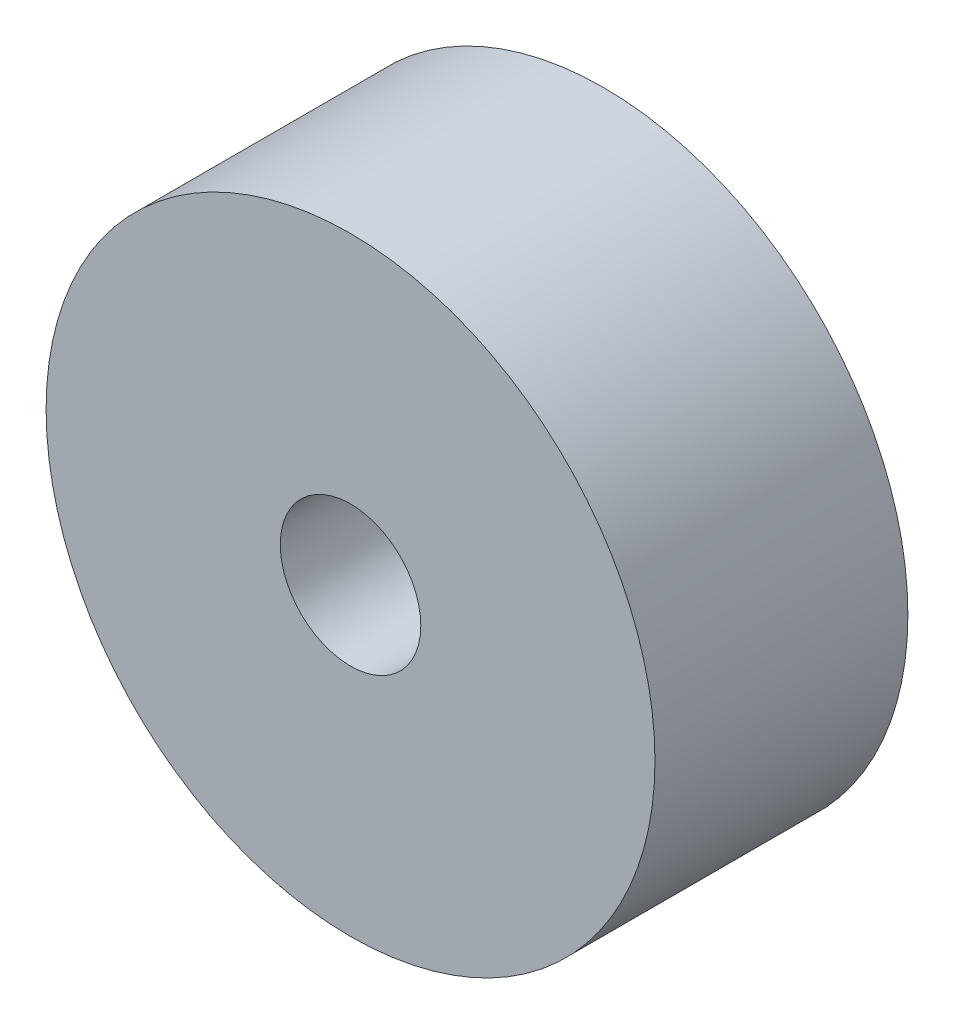
ISO-10303-21;
HEADER;
FILE_DESCRIPTION(('STEP AP214'),'2;1');
FILE_NAME('part.step','',(''),(''),'','','');
FILE_SCHEMA(('AUTOMOTIVE_DESIGN { 1 0 10303 214 1 1 1 1 }'));
ENDSEC;
DATA;
#1=APPLICATION_CONTEXT('core data for automotive mechanical design processes');
#2=APPLICATION_PROTOCOL_DEFINITION('international standard','automotive_design',2000,#1);
#3=PRODUCT_CONTEXT('',#1,'mechanical');
#4=PRODUCT('Part','Part','',(#3));
#5=PRODUCT_RELATED_PRODUCT_CATEGORY('part','',(#4));
#6=PRODUCT_DEFINITION_FORMATION('','',#4);
#7=PRODUCT_DEFINITION_CONTEXT('part definition',#1,'design');
#8=PRODUCT_DEFINITION('design','',#6,#7);
#9=PRODUCT_DEFINITION_SHAPE('','',#8);
#10=(LENGTH_UNIT() NAMED_UNIT(*) SI_UNIT(.MILLI.,.METRE.));
#11=(NAMED_UNIT(*) PLANE_ANGLE_UNIT() SI_UNIT($,.RADIAN.));
#12=(NAMED_UNIT(*) SI_UNIT($,.STERADIAN.) SOLID_ANGLE_UNIT());
#13=UNCERTAINTY_MEASURE_WITH_UNIT(LENGTH_MEASURE(1.E-05),#10,'distance_accuracy_value','');
#14=(GEOMETRIC_REPRESENTATION_CONTEXT(3) GLOBAL_UNCERTAINTY_ASSIGNED_CONTEXT((#13)) GLOBAL_UNIT_ASSIGNED_CONTEXT((#10,
#11,#12)) REPRESENTATION_CONTEXT('',''));
#15=CARTESIAN_POINT('',(0.,0.,0.));
#16=DIRECTION('',(0.,0.,1.));
#17=DIRECTION('',(1.,0.,0.));
#18=AXIS2_PLACEMENT_3D('',#15,#16,#17);
#19=CARTESIAN_POINT('',(0.,0.,27.));
#20=DIRECTION('',(0.,0.,-1.));
#21=DIRECTION('',(-1.,0.,0.));
#22=AXIS2_PLACEMENT_3D('',#19,#20,#21);
#23=CYLINDRICAL_SURFACE('',#22,7.5);
#24=CARTESIAN_POINT('',(0.,0.,27.));
#25=DIRECTION('',(0.,0.,1.));
#26=DIRECTION('',(1.,0.,0.));
#27=AXIS2_PLACEMENT_3D('',#24,#25,#26);
#28=CIRCLE('',#27,7.5);
#29=CARTESIAN_POINT('',(7.5,0.,27.));
#30=VERTEX_POINT('',#29);
#31=EDGE_CURVE('E47',#30,#30,#28,.T.);
#32=ORIENTED_EDGE('',*,*,#31,.T.);
#33=EDGE_LOOP('',(#32));
#34=FACE_BOUND('',#33,.T.);
#35=CARTESIAN_POINT('',(0.,0.,0.));
#36=DIRECTION('',(0.,0.,1.));
#37=DIRECTION('',(1.,0.,0.));
#38=AXIS2_PLACEMENT_3D('',#35,#36,#37);
#39=CIRCLE('',#38,7.5);
#40=CARTESIAN_POINT('',(7.5,0.,0.));
#41=VERTEX_POINT('',#40);
#42=EDGE_CURVE('E54',#41,#41,#39,.T.);
#43=ORIENTED_EDGE('',*,*,#42,.F.);
#44=EDGE_LOOP('',(#43));
#45=FACE_BOUND('',#44,.T.);
#46=ADVANCED_FACE('F39',(#34,#45),#23,.F.);
#47=CARTESIAN_POINT('',(0.,0.,27.));
#48=DIRECTION('',(0.,0.,-1.));
#49=DIRECTION('',(-1.,0.,0.));
#50=AXIS2_PLACEMENT_3D('',#47,#48,#49);
#51=CYLINDRICAL_SURFACE('',#50,32.5);
#52=CARTESIAN_POINT('',(0.,0.,27.));
#53=DIRECTION('',(0.,0.,1.));
#54=DIRECTION('',(1.,0.,0.));
#55=AXIS2_PLACEMENT_3D('',#52,#53,#54);
#56=CIRCLE('',#55,32.5);
#57=CARTESIAN_POINT('',(32.5,0.,27.));
#58=VERTEX_POINT('',#57);
#59=EDGE_CURVE('E10',#58,#58,#56,.T.);
#60=ORIENTED_EDGE('',*,*,#59,.F.);
#61=EDGE_LOOP('',(#60));
#62=FACE_BOUND('',#61,.T.);
#63=CARTESIAN_POINT('',(0.,0.,0.));
#64=DIRECTION('',(0.,0.,1.));
#65=DIRECTION('',(1.,0.,0.));
#66=AXIS2_PLACEMENT_3D('',#63,#64,#65);
#67=CIRCLE('',#66,32.5);
#68=CARTESIAN_POINT('',(32.5,0.,0.));
#69=VERTEX_POINT('',#68);
#70=EDGE_CURVE('E42',#69,#69,#67,.T.);
#71=ORIENTED_EDGE('',*,*,#70,.T.);
#72=EDGE_LOOP('',(#71));
#73=FACE_BOUND('',#72,.T.);
#74=ADVANCED_FACE('F63',(#62,#73),#51,.T.);
#75=CARTESIAN_POINT('',(0.,0.,27.));
#76=DIRECTION('',(0.,0.,1.));
#77=DIRECTION('',(1.,0.,0.));
#78=AXIS2_PLACEMENT_3D('',#75,#76,#77);
#79=PLANE('',#78);
#80=ORIENTED_EDGE('',*,*,#31,.F.);
#81=EDGE_LOOP('',(#80));
#82=FACE_BOUND('',#81,.T.);
#83=ORIENTED_EDGE('',*,*,#59,.T.);
#84=EDGE_LOOP('',(#83));
#85=FACE_BOUND('',#84,.T.);
#86=ADVANCED_FACE('F67',(#82,#85),#79,.T.);
#87=CARTESIAN_POINT('',(0.,0.,0.));
#88=DIRECTION('',(0.,0.,1.));
#89=DIRECTION('',(1.,0.,0.));
#90=AXIS2_PLACEMENT_3D('',#87,#88,#89);
#91=PLANE('',#90);
#92=ORIENTED_EDGE('',*,*,#42,.T.);
#93=EDGE_LOOP('',(#92));
#94=FACE_BOUND('',#93,.T.);
#95=ORIENTED_EDGE('',*,*,#70,.F.);
#96=EDGE_LOOP('',(#95));
#97=FACE_BOUND('',#96,.T.);
#98=ADVANCED_FACE('F65',(#94,#97),#91,.F.);
#99=CLOSED_SHELL('',(#46,#74,#86,#98));
#100=MANIFOLD_SOLID_BREP('B2',#99);
#101=ADVANCED_BREP_SHAPE_REPRESENTATION('',(#18,#100),#14);
#102=SHAPE_DEFINITION_REPRESENTATION(#9,#101);
ENDSEC;
END-ISO-10303-21;
